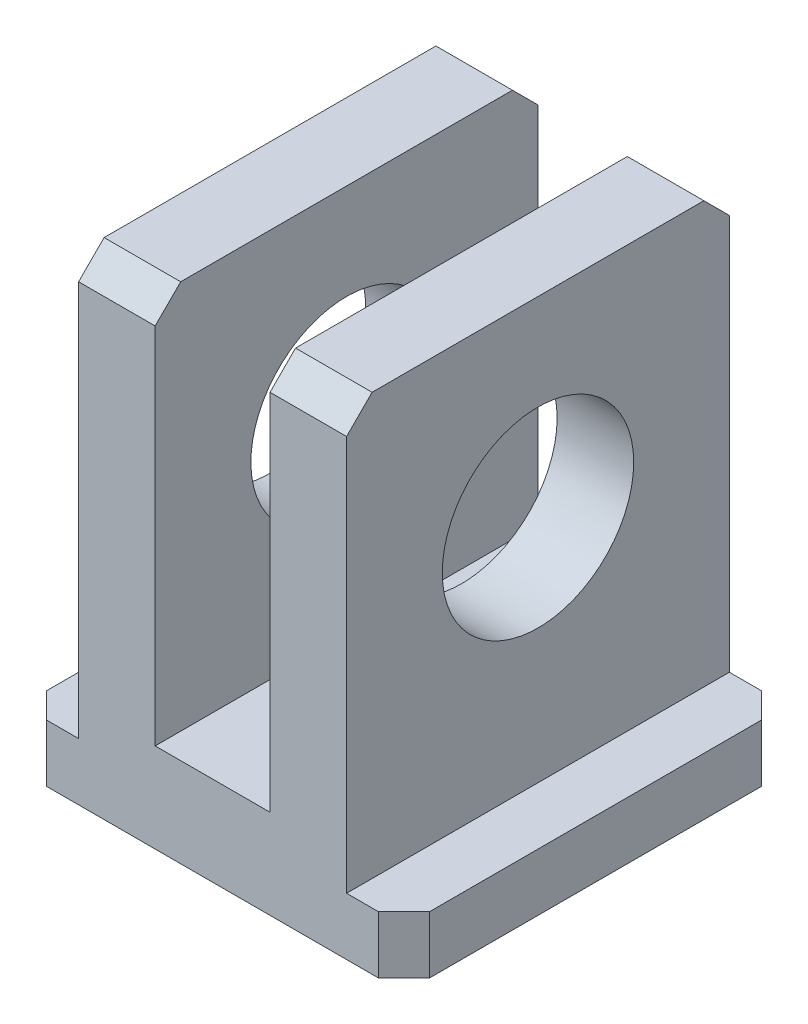
ISO-10303-21;
HEADER;
FILE_DESCRIPTION(('STEP AP214'),'2;1');
FILE_NAME('part.step','',(''),(''),'','','');
FILE_SCHEMA(('AUTOMOTIVE_DESIGN { 1 0 10303 214 1 1 1 1 }'));
ENDSEC;
DATA;
#1=APPLICATION_CONTEXT('core data for automotive mechanical design processes');
#2=APPLICATION_PROTOCOL_DEFINITION('international standard','automotive_design',2000,#1);
#3=PRODUCT_CONTEXT('',#1,'mechanical');
#4=PRODUCT('Part','Part','',(#3));
#5=PRODUCT_RELATED_PRODUCT_CATEGORY('part','',(#4));
#6=PRODUCT_DEFINITION_FORMATION('','',#4);
#7=PRODUCT_DEFINITION_CONTEXT('part definition',#1,'design');
#8=PRODUCT_DEFINITION('design','',#6,#7);
#9=PRODUCT_DEFINITION_SHAPE('','',#8);
#10=(LENGTH_UNIT() NAMED_UNIT(*) SI_UNIT(.MILLI.,.METRE.));
#11=(NAMED_UNIT(*) PLANE_ANGLE_UNIT() SI_UNIT($,.RADIAN.));
#12=(NAMED_UNIT(*) SI_UNIT($,.STERADIAN.) SOLID_ANGLE_UNIT());
#13=UNCERTAINTY_MEASURE_WITH_UNIT(LENGTH_MEASURE(1.E-05),#10,'distance_accuracy_value','');
#14=(GEOMETRIC_REPRESENTATION_CONTEXT(3) GLOBAL_UNCERTAINTY_ASSIGNED_CONTEXT((#13)) GLOBAL_UNIT_ASSIGNED_CONTEXT((#10,
#11,#12)) REPRESENTATION_CONTEXT('',''));
#15=CARTESIAN_POINT('',(0.,0.,0.));
#16=DIRECTION('',(0.,0.,1.));
#17=DIRECTION('',(1.,0.,0.));
#18=AXIS2_PLACEMENT_3D('',#15,#16,#17);
#19=CARTESIAN_POINT('',(-15.,35.5,15.));
#20=DIRECTION('',(0.,0.707106781186547,0.707106781186548));
#21=DIRECTION('',(0.,-0.707106781186548,0.707106781186547));
#22=AXIS2_PLACEMENT_3D('',#19,#20,#21);
#23=PLANE('',#22);
#24=DIRECTION('',(0.,0.707106781186548,-0.707106781186547));
#25=VECTOR('',#24,1.);
#26=CARTESIAN_POINT('',(-10.5,35.5,15.));
#27=LINE('',#26,#25);
#28=CARTESIAN_POINT('',(-10.5,35.5,15.));
#29=VERTEX_POINT('',#28);
#30=CARTESIAN_POINT('',(-10.5,37.5,13.));
#31=VERTEX_POINT('',#30);
#32=EDGE_CURVE('E257',#29,#31,#27,.T.);
#33=ORIENTED_EDGE('',*,*,#32,.F.);
#34=DIRECTION('',(1.,0.,0.));
#35=VECTOR('',#34,1.);
#36=CARTESIAN_POINT('',(-15.,35.5,15.));
#37=LINE('',#36,#35);
#38=CARTESIAN_POINT('',(-4.5,35.5,15.));
#39=VERTEX_POINT('',#38);
#40=EDGE_CURVE('E263',#29,#39,#37,.T.);
#41=ORIENTED_EDGE('',*,*,#40,.T.);
#42=DIRECTION('',(0.,-0.707106781186548,0.707106781186547));
#43=VECTOR('',#42,1.);
#44=CARTESIAN_POINT('',(-4.5,35.5,15.));
#45=LINE('',#44,#43);
#46=CARTESIAN_POINT('',(-4.5,37.5,13.));
#47=VERTEX_POINT('',#46);
#48=EDGE_CURVE('E253',#47,#39,#45,.T.);
#49=ORIENTED_EDGE('',*,*,#48,.F.);
#50=DIRECTION('',(1.,0.,0.));
#51=VECTOR('',#50,1.);
#52=CARTESIAN_POINT('',(-15.,37.5,13.));
#53=LINE('',#52,#51);
#54=EDGE_CURVE('E264',#31,#47,#53,.T.);
#55=ORIENTED_EDGE('',*,*,#54,.F.);
#56=EDGE_LOOP('',(#33,#41,#49,#55));
#57=FACE_BOUND('',#56,.T.);
#58=ADVANCED_FACE('F41',(#57),#23,.T.);
#59=CARTESIAN_POINT('',(-15.,37.5,13.));
#60=DIRECTION('',(0.,1.,0.));
#61=DIRECTION('',(0.,0.,1.));
#62=AXIS2_PLACEMENT_3D('',#59,#60,#61);
#63=PLANE('',#62);
#64=DIRECTION('',(0.,0.,1.));
#65=VECTOR('',#64,1.);
#66=CARTESIAN_POINT('',(-10.5,37.5,-15.));
#67=LINE('',#66,#65);
#68=CARTESIAN_POINT('',(-10.5,37.5,-13.));
#69=VERTEX_POINT('',#68);
#70=EDGE_CURVE('E64',#69,#31,#67,.T.);
#71=ORIENTED_EDGE('',*,*,#70,.T.);
#72=ORIENTED_EDGE('',*,*,#54,.T.);
#73=DIRECTION('',(0.,0.,1.));
#74=VECTOR('',#73,1.);
#75=CARTESIAN_POINT('',(-4.5,37.5,-15.));
#76=LINE('',#75,#74);
#77=CARTESIAN_POINT('',(-4.5,37.5,-13.));
#78=VERTEX_POINT('',#77);
#79=EDGE_CURVE('E236',#78,#47,#76,.T.);
#80=ORIENTED_EDGE('',*,*,#79,.F.);
#81=DIRECTION('',(1.,0.,0.));
#82=VECTOR('',#81,1.);
#83=CARTESIAN_POINT('',(-15.,37.5,-13.));
#84=LINE('',#83,#82);
#85=EDGE_CURVE('E268',#69,#78,#84,.T.);
#86=ORIENTED_EDGE('',*,*,#85,.F.);
#87=EDGE_LOOP('',(#71,#72,#80,#86));
#88=FACE_BOUND('',#87,.T.);
#89=ADVANCED_FACE('F391',(#88),#63,.T.);
#90=CARTESIAN_POINT('',(-15.,35.5,-15.));
#91=DIRECTION('',(0.,0.707106781186547,-0.707106781186548));
#92=DIRECTION('',(0.,0.707106781186548,0.707106781186547));
#93=AXIS2_PLACEMENT_3D('',#90,#91,#92);
#94=PLANE('',#93);
#95=DIRECTION('',(0.,-0.707106781186548,-0.707106781186547));
#96=VECTOR('',#95,1.);
#97=CARTESIAN_POINT('',(-10.5,35.5,-15.));
#98=LINE('',#97,#96);
#99=CARTESIAN_POINT('',(-10.5,35.5,-15.));
#100=VERTEX_POINT('',#99);
#101=EDGE_CURVE('E11',#69,#100,#98,.T.);
#102=ORIENTED_EDGE('',*,*,#101,.F.);
#103=ORIENTED_EDGE('',*,*,#85,.T.);
#104=DIRECTION('',(0.,0.707106781186548,0.707106781186547));
#105=VECTOR('',#104,1.);
#106=CARTESIAN_POINT('',(-4.5,35.5,-15.));
#107=LINE('',#106,#105);
#108=CARTESIAN_POINT('',(-4.5,35.5,-15.));
#109=VERTEX_POINT('',#108);
#110=EDGE_CURVE('E324',#109,#78,#107,.T.);
#111=ORIENTED_EDGE('',*,*,#110,.F.);
#112=DIRECTION('',(1.,0.,0.));
#113=VECTOR('',#112,1.);
#114=CARTESIAN_POINT('',(-15.,35.5,-15.));
#115=LINE('',#114,#113);
#116=EDGE_CURVE('E272',#100,#109,#115,.T.);
#117=ORIENTED_EDGE('',*,*,#116,.F.);
#118=EDGE_LOOP('',(#102,#103,#111,#117));
#119=FACE_BOUND('',#118,.T.);
#120=ADVANCED_FACE('F396',(#119),#94,.T.);
#121=CARTESIAN_POINT('',(-15.,4.5,13.));
#122=DIRECTION('',(1.,0.,0.));
#123=DIRECTION('',(0.,0.,-1.));
#124=AXIS2_PLACEMENT_3D('',#121,#122,#123);
#125=PLANE('',#124);
#126=DIRECTION('',(0.,-1.,0.));
#127=VECTOR('',#126,1.);
#128=CARTESIAN_POINT('',(-15.,4.5,13.));
#129=LINE('',#128,#127);
#130=CARTESIAN_POINT('',(-15.,4.5,13.));
#131=VERTEX_POINT('',#130);
#132=CARTESIAN_POINT('',(-15.,0.,13.));
#133=VERTEX_POINT('',#132);
#134=EDGE_CURVE('E319',#131,#133,#129,.T.);
#135=ORIENTED_EDGE('',*,*,#134,.F.);
#136=DIRECTION('',(0.,0.,1.));
#137=VECTOR('',#136,1.);
#138=CARTESIAN_POINT('',(-15.,4.5,-15.));
#139=LINE('',#138,#137);
#140=CARTESIAN_POINT('',(-15.,4.5,-13.));
#141=VERTEX_POINT('',#140);
#142=EDGE_CURVE('E186',#141,#131,#139,.T.);
#143=ORIENTED_EDGE('',*,*,#142,.F.);
#144=DIRECTION('',(0.,-1.,0.));
#145=VECTOR('',#144,1.);
#146=CARTESIAN_POINT('',(-15.,4.5,-13.));
#147=LINE('',#146,#145);
#148=CARTESIAN_POINT('',(-15.,0.,-13.));
#149=VERTEX_POINT('',#148);
#150=EDGE_CURVE('E284',#141,#149,#147,.T.);
#151=ORIENTED_EDGE('',*,*,#150,.T.);
#152=DIRECTION('',(0.,0.,1.));
#153=VECTOR('',#152,1.);
#154=CARTESIAN_POINT('',(-15.,0.,13.));
#155=LINE('',#154,#153);
#156=EDGE_CURVE('E285',#149,#133,#155,.T.);
#157=ORIENTED_EDGE('',*,*,#156,.T.);
#158=EDGE_LOOP('',(#135,#143,#151,#157));
#159=FACE_BOUND('',#158,.T.);
#160=ADVANCED_FACE('F43',(#159),#125,.F.);
#161=CARTESIAN_POINT('',(-15.,4.5,13.));
#162=DIRECTION('',(0.707106781186547,0.,-0.707106781186547));
#163=DIRECTION('',(-0.707106781186548,0.,-0.707106781186548));
#164=AXIS2_PLACEMENT_3D('',#161,#162,#163);
#165=PLANE('',#164);
#166=DIRECTION('',(0.707106781186548,0.,0.707106781186548));
#167=VECTOR('',#166,1.);
#168=CARTESIAN_POINT('',(-15.,0.,13.));
#169=LINE('',#168,#167);
#170=CARTESIAN_POINT('',(-13.,0.,15.));
#171=VERTEX_POINT('',#170);
#172=EDGE_CURVE('E288',#133,#171,#169,.T.);
#173=ORIENTED_EDGE('',*,*,#172,.T.);
#174=DIRECTION('',(0.,-1.,0.));
#175=VECTOR('',#174,1.);
#176=CARTESIAN_POINT('',(-13.,4.5,15.));
#177=LINE('',#176,#175);
#178=CARTESIAN_POINT('',(-13.,4.5,15.));
#179=VERTEX_POINT('',#178);
#180=EDGE_CURVE('E316',#179,#171,#177,.T.);
#181=ORIENTED_EDGE('',*,*,#180,.F.);
#182=DIRECTION('',(0.707106781186548,0.,0.707106781186548));
#183=VECTOR('',#182,1.);
#184=CARTESIAN_POINT('',(-15.,4.5,13.));
#185=LINE('',#184,#183);
#186=EDGE_CURVE('E275',#131,#179,#185,.T.);
#187=ORIENTED_EDGE('',*,*,#186,.F.);
#188=ORIENTED_EDGE('',*,*,#134,.T.);
#189=EDGE_LOOP('',(#173,#181,#187,#188));
#190=FACE_BOUND('',#189,.T.);
#191=ADVANCED_FACE('F379',(#190),#165,.F.);
#192=CARTESIAN_POINT('',(-13.,4.5,15.));
#193=DIRECTION('',(0.,0.,-1.));
#194=DIRECTION('',(-1.,0.,0.));
#195=AXIS2_PLACEMENT_3D('',#192,#193,#194);
#196=PLANE('',#195);
#197=ORIENTED_EDGE('',*,*,#40,.F.);
#198=DIRECTION('',(0.,1.,0.));
#199=VECTOR('',#198,1.);
#200=CARTESIAN_POINT('',(-10.5,4.5,15.));
#201=LINE('',#200,#199);
#202=CARTESIAN_POINT('',(-10.5,4.5,15.));
#203=VERTEX_POINT('',#202);
#204=EDGE_CURVE('E199',#203,#29,#201,.T.);
#205=ORIENTED_EDGE('',*,*,#204,.F.);
#206=DIRECTION('',(1.,0.,0.));
#207=VECTOR('',#206,1.);
#208=CARTESIAN_POINT('',(-15.,4.5,15.));
#209=LINE('',#208,#207);
#210=EDGE_CURVE('E184',#179,#203,#209,.T.);
#211=ORIENTED_EDGE('',*,*,#210,.F.);
#212=ORIENTED_EDGE('',*,*,#180,.T.);
#213=DIRECTION('',(1.,0.,0.));
#214=VECTOR('',#213,1.);
#215=CARTESIAN_POINT('',(-13.,0.,15.));
#216=LINE('',#215,#214);
#217=CARTESIAN_POINT('',(13.,0.,15.));
#218=VERTEX_POINT('',#217);
#219=EDGE_CURVE('E290',#171,#218,#216,.T.);
#220=ORIENTED_EDGE('',*,*,#219,.T.);
#221=DIRECTION('',(0.,-1.,0.));
#222=VECTOR('',#221,1.);
#223=CARTESIAN_POINT('',(13.,4.5,15.));
#224=LINE('',#223,#222);
#225=CARTESIAN_POINT('',(13.,4.5,15.));
#226=VERTEX_POINT('',#225);
#227=EDGE_CURVE('E313',#226,#218,#224,.T.);
#228=ORIENTED_EDGE('',*,*,#227,.F.);
#229=DIRECTION('',(1.,0.,0.));
#230=VECTOR('',#229,1.);
#231=CARTESIAN_POINT('',(15.,4.5,15.));
#232=LINE('',#231,#230);
#233=CARTESIAN_POINT('',(10.5,4.5,15.));
#234=VERTEX_POINT('',#233);
#235=EDGE_CURVE('E206',#234,#226,#232,.T.);
#236=ORIENTED_EDGE('',*,*,#235,.F.);
#237=DIRECTION('',(0.,-1.,0.));
#238=VECTOR('',#237,1.);
#239=CARTESIAN_POINT('',(10.5,4.5,15.));
#240=LINE('',#239,#238);
#241=CARTESIAN_POINT('',(10.5,35.5,15.));
#242=VERTEX_POINT('',#241);
#243=EDGE_CURVE('E221',#242,#234,#240,.T.);
#244=ORIENTED_EDGE('',*,*,#243,.F.);
#245=CARTESIAN_POINT('',(4.5,35.5,15.));
#246=VERTEX_POINT('',#245);
#247=EDGE_CURVE('E260',#246,#242,#37,.T.);
#248=ORIENTED_EDGE('',*,*,#247,.F.);
#249=DIRECTION('',(0.,1.,0.));
#250=VECTOR('',#249,1.);
#251=CARTESIAN_POINT('',(4.5,7.,15.));
#252=LINE('',#251,#250);
#253=CARTESIAN_POINT('',(4.5,7.,15.));
#254=VERTEX_POINT('',#253);
#255=EDGE_CURVE('E238',#254,#246,#252,.T.);
#256=ORIENTED_EDGE('',*,*,#255,.F.);
#257=DIRECTION('',(1.,0.,0.));
#258=VECTOR('',#257,1.);
#259=CARTESIAN_POINT('',(-4.5,7.,15.));
#260=LINE('',#259,#258);
#261=CARTESIAN_POINT('',(-4.5,7.,15.));
#262=VERTEX_POINT('',#261);
#263=EDGE_CURVE('E240',#262,#254,#260,.T.);
#264=ORIENTED_EDGE('',*,*,#263,.F.);
#265=DIRECTION('',(0.,-1.,0.));
#266=VECTOR('',#265,1.);
#267=CARTESIAN_POINT('',(-4.5,37.5,15.));
#268=LINE('',#267,#266);
#269=EDGE_CURVE('E220',#39,#262,#268,.T.);
#270=ORIENTED_EDGE('',*,*,#269,.F.);
#271=EDGE_LOOP('',(#197,#205,#211,#212,#220,#228,#236,#244,#248,#256,#264,#270));
#272=FACE_BOUND('',#271,.T.);
#273=ADVANCED_FACE('F352',(#272),#196,.F.);
#274=CARTESIAN_POINT('',(13.,4.5,15.));
#275=DIRECTION('',(-0.707106781186547,0.,-0.707106781186547));
#276=DIRECTION('',(-0.707106781186548,0.,0.707106781186548));
#277=AXIS2_PLACEMENT_3D('',#274,#275,#276);
#278=PLANE('',#277);
#279=DIRECTION('',(0.707106781186548,0.,-0.707106781186548));
#280=VECTOR('',#279,1.);
#281=CARTESIAN_POINT('',(13.,0.,15.));
#282=LINE('',#281,#280);
#283=CARTESIAN_POINT('',(15.,0.,13.));
#284=VERTEX_POINT('',#283);
#285=EDGE_CURVE('E292',#218,#284,#282,.T.);
#286=ORIENTED_EDGE('',*,*,#285,.T.);
#287=DIRECTION('',(0.,-1.,0.));
#288=VECTOR('',#287,1.);
#289=CARTESIAN_POINT('',(15.,4.5,13.));
#290=LINE('',#289,#288);
#291=CARTESIAN_POINT('',(15.,4.5,13.));
#292=VERTEX_POINT('',#291);
#293=EDGE_CURVE('E310',#292,#284,#290,.T.);
#294=ORIENTED_EDGE('',*,*,#293,.F.);
#295=DIRECTION('',(0.707106781186548,0.,-0.707106781186548));
#296=VECTOR('',#295,1.);
#297=CARTESIAN_POINT('',(13.,4.5,15.));
#298=LINE('',#297,#296);
#299=EDGE_CURVE('E277',#226,#292,#298,.T.);
#300=ORIENTED_EDGE('',*,*,#299,.F.);
#301=ORIENTED_EDGE('',*,*,#227,.T.);
#302=EDGE_LOOP('',(#286,#294,#300,#301));
#303=FACE_BOUND('',#302,.T.);
#304=ADVANCED_FACE('F437',(#303),#278,.F.);
#305=CARTESIAN_POINT('',(15.,4.5,13.));
#306=DIRECTION('',(-1.,0.,0.));
#307=DIRECTION('',(0.,0.,1.));
#308=AXIS2_PLACEMENT_3D('',#305,#306,#307);
#309=PLANE('',#308);
#310=DIRECTION('',(0.,-1.,0.));
#311=VECTOR('',#310,1.);
#312=CARTESIAN_POINT('',(15.,4.5,-13.));
#313=LINE('',#312,#311);
#314=CARTESIAN_POINT('',(15.,4.5,-13.));
#315=VERTEX_POINT('',#314);
#316=CARTESIAN_POINT('',(15.,0.,-13.));
#317=VERTEX_POINT('',#316);
#318=EDGE_CURVE('E307',#315,#317,#313,.T.);
#319=ORIENTED_EDGE('',*,*,#318,.F.);
#320=DIRECTION('',(0.,0.,1.));
#321=VECTOR('',#320,1.);
#322=CARTESIAN_POINT('',(15.,4.5,-15.));
#323=LINE('',#322,#321);
#324=EDGE_CURVE('E211',#315,#292,#323,.T.);
#325=ORIENTED_EDGE('',*,*,#324,.T.);
#326=ORIENTED_EDGE('',*,*,#293,.T.);
#327=DIRECTION('',(0.,0.,-1.));
#328=VECTOR('',#327,1.);
#329=CARTESIAN_POINT('',(15.,0.,13.));
#330=LINE('',#329,#328);
#331=EDGE_CURVE('E294',#284,#317,#330,.T.);
#332=ORIENTED_EDGE('',*,*,#331,.T.);
#333=EDGE_LOOP('',(#319,#325,#326,#332));
#334=FACE_BOUND('',#333,.T.);
#335=ADVANCED_FACE('F434',(#334),#309,.F.);
#336=CARTESIAN_POINT('',(13.,4.5,-15.));
#337=DIRECTION('',(-0.707106781186547,0.,0.707106781186547));
#338=DIRECTION('',(0.707106781186548,0.,0.707106781186548));
#339=AXIS2_PLACEMENT_3D('',#336,#337,#338);
#340=PLANE('',#339);
#341=DIRECTION('',(-0.707106781186548,0.,-0.707106781186548));
#342=VECTOR('',#341,1.);
#343=CARTESIAN_POINT('',(13.,0.,-15.));
#344=LINE('',#343,#342);
#345=CARTESIAN_POINT('',(13.,0.,-15.));
#346=VERTEX_POINT('',#345);
#347=EDGE_CURVE('E296',#317,#346,#344,.T.);
#348=ORIENTED_EDGE('',*,*,#347,.T.);
#349=DIRECTION('',(0.,-1.,0.));
#350=VECTOR('',#349,1.);
#351=CARTESIAN_POINT('',(13.,4.5,-15.));
#352=LINE('',#351,#350);
#353=CARTESIAN_POINT('',(13.,4.5,-15.));
#354=VERTEX_POINT('',#353);
#355=EDGE_CURVE('E304',#354,#346,#352,.T.);
#356=ORIENTED_EDGE('',*,*,#355,.F.);
#357=DIRECTION('',(-0.707106781186548,0.,-0.707106781186548));
#358=VECTOR('',#357,1.);
#359=CARTESIAN_POINT('',(13.,4.5,-15.));
#360=LINE('',#359,#358);
#361=EDGE_CURVE('E280',#315,#354,#360,.T.);
#362=ORIENTED_EDGE('',*,*,#361,.F.);
#363=ORIENTED_EDGE('',*,*,#318,.T.);
#364=EDGE_LOOP('',(#348,#356,#362,#363));
#365=FACE_BOUND('',#364,.T.);
#366=ADVANCED_FACE('F362',(#365),#340,.F.);
#367=CARTESIAN_POINT('',(-13.,4.5,-15.));
#368=DIRECTION('',(0.,0.,1.));
#369=DIRECTION('',(1.,0.,0.));
#370=AXIS2_PLACEMENT_3D('',#367,#368,#369);
#371=PLANE('',#370);
#372=DIRECTION('',(1.,0.,0.));
#373=VECTOR('',#372,1.);
#374=CARTESIAN_POINT('',(-15.,4.5,-15.));
#375=LINE('',#374,#373);
#376=CARTESIAN_POINT('',(-13.,4.5,-15.));
#377=VERTEX_POINT('',#376);
#378=CARTESIAN_POINT('',(-10.5,4.5,-15.));
#379=VERTEX_POINT('',#378);
#380=EDGE_CURVE('E181',#377,#379,#375,.T.);
#381=ORIENTED_EDGE('',*,*,#380,.T.);
#382=DIRECTION('',(0.,1.,0.));
#383=VECTOR('',#382,1.);
#384=CARTESIAN_POINT('',(-10.5,4.5,-15.));
#385=LINE('',#384,#383);
#386=EDGE_CURVE('E189',#379,#100,#385,.T.);
#387=ORIENTED_EDGE('',*,*,#386,.T.);
#388=ORIENTED_EDGE('',*,*,#116,.T.);
#389=DIRECTION('',(0.,-1.,0.));
#390=VECTOR('',#389,1.);
#391=CARTESIAN_POINT('',(-4.5,37.5,-15.));
#392=LINE('',#391,#390);
#393=CARTESIAN_POINT('',(-4.5,7.,-15.));
#394=VERTEX_POINT('',#393);
#395=EDGE_CURVE('E241',#109,#394,#392,.T.);
#396=ORIENTED_EDGE('',*,*,#395,.T.);
#397=DIRECTION('',(1.,0.,0.));
#398=VECTOR('',#397,1.);
#399=CARTESIAN_POINT('',(-4.5,7.,-15.));
#400=LINE('',#399,#398);
#401=CARTESIAN_POINT('',(4.5,7.,-15.));
#402=VERTEX_POINT('',#401);
#403=EDGE_CURVE('E247',#394,#402,#400,.T.);
#404=ORIENTED_EDGE('',*,*,#403,.T.);
#405=DIRECTION('',(0.,1.,0.));
#406=VECTOR('',#405,1.);
#407=CARTESIAN_POINT('',(4.5,7.,-15.));
#408=LINE('',#407,#406);
#409=CARTESIAN_POINT('',(4.5,35.5,-15.));
#410=VERTEX_POINT('',#409);
#411=EDGE_CURVE('E232',#402,#410,#408,.T.);
#412=ORIENTED_EDGE('',*,*,#411,.T.);
#413=CARTESIAN_POINT('',(10.5,35.5,-15.));
#414=VERTEX_POINT('',#413);
#415=EDGE_CURVE('E259',#410,#414,#115,.T.);
#416=ORIENTED_EDGE('',*,*,#415,.T.);
#417=DIRECTION('',(0.,-1.,0.));
#418=VECTOR('',#417,1.);
#419=CARTESIAN_POINT('',(10.5,4.5,-15.));
#420=LINE('',#419,#418);
#421=CARTESIAN_POINT('',(10.5,4.5,-15.));
#422=VERTEX_POINT('',#421);
#423=EDGE_CURVE('E214',#414,#422,#420,.T.);
#424=ORIENTED_EDGE('',*,*,#423,.T.);
#425=DIRECTION('',(1.,0.,0.));
#426=VECTOR('',#425,1.);
#427=CARTESIAN_POINT('',(15.,4.5,-15.));
#428=LINE('',#427,#426);
#429=EDGE_CURVE('E223',#422,#354,#428,.T.);
#430=ORIENTED_EDGE('',*,*,#429,.T.);
#431=ORIENTED_EDGE('',*,*,#355,.T.);
#432=DIRECTION('',(-1.,0.,0.));
#433=VECTOR('',#432,1.);
#434=CARTESIAN_POINT('',(-13.,0.,-15.));
#435=LINE('',#434,#433);
#436=CARTESIAN_POINT('',(-13.,0.,-15.));
#437=VERTEX_POINT('',#436);
#438=EDGE_CURVE('E298',#346,#437,#435,.T.);
#439=ORIENTED_EDGE('',*,*,#438,.T.);
#440=DIRECTION('',(0.,-1.,0.));
#441=VECTOR('',#440,1.);
#442=CARTESIAN_POINT('',(-13.,4.5,-15.));
#443=LINE('',#442,#441);
#444=EDGE_CURVE('E197',#377,#437,#443,.T.);
#445=ORIENTED_EDGE('',*,*,#444,.F.);
#446=EDGE_LOOP('',(#381,#387,#388,#396,#404,#412,#416,#424,#430,#431,#439,#445));
#447=FACE_BOUND('',#446,.T.);
#448=ADVANCED_FACE('F195',(#447),#371,.F.);
#449=CARTESIAN_POINT('',(-15.,4.5,-13.));
#450=DIRECTION('',(0.707106781186547,0.,0.707106781186547));
#451=DIRECTION('',(0.707106781186548,0.,-0.707106781186548));
#452=AXIS2_PLACEMENT_3D('',#449,#450,#451);
#453=PLANE('',#452);
#454=DIRECTION('',(-0.707106781186548,0.,0.707106781186548));
#455=VECTOR('',#454,1.);
#456=CARTESIAN_POINT('',(-15.,0.,-13.));
#457=LINE('',#456,#455);
#458=EDGE_CURVE('E278',#437,#149,#457,.T.);
#459=ORIENTED_EDGE('',*,*,#458,.T.);
#460=ORIENTED_EDGE('',*,*,#150,.F.);
#461=DIRECTION('',(-0.707106781186548,0.,0.707106781186548));
#462=VECTOR('',#461,1.);
#463=CARTESIAN_POINT('',(-15.,4.5,-13.));
#464=LINE('',#463,#462);
#465=EDGE_CURVE('E282',#377,#141,#464,.T.);
#466=ORIENTED_EDGE('',*,*,#465,.F.);
#467=ORIENTED_EDGE('',*,*,#444,.T.);
#468=EDGE_LOOP('',(#459,#460,#466,#467));
#469=FACE_BOUND('',#468,.T.);
#470=ADVANCED_FACE('F372',(#469),#453,.F.);
#471=CARTESIAN_POINT('',(0.,0.,0.));
#472=DIRECTION('',(0.,-1.,0.));
#473=DIRECTION('',(0.,0.,-1.));
#474=AXIS2_PLACEMENT_3D('',#471,#472,#473);
#475=PLANE('',#474);
#476=ORIENTED_EDGE('',*,*,#156,.F.);
#477=ORIENTED_EDGE('',*,*,#458,.F.);
#478=ORIENTED_EDGE('',*,*,#438,.F.);
#479=ORIENTED_EDGE('',*,*,#347,.F.);
#480=ORIENTED_EDGE('',*,*,#331,.F.);
#481=ORIENTED_EDGE('',*,*,#285,.F.);
#482=ORIENTED_EDGE('',*,*,#219,.F.);
#483=ORIENTED_EDGE('',*,*,#172,.F.);
#484=EDGE_LOOP('',(#476,#477,#478,#479,#480,#481,#482,#483));
#485=FACE_BOUND('',#484,.T.);
#486=ADVANCED_FACE('F368',(#485),#475,.T.);
#487=DIRECTION('',(0.,-0.707106781186548,0.707106781186547));
#488=VECTOR('',#487,1.);
#489=CARTESIAN_POINT('',(10.5,35.5,15.));
#490=LINE('',#489,#488);
#491=CARTESIAN_POINT('',(10.5,37.5,13.));
#492=VERTEX_POINT('',#491);
#493=EDGE_CURVE('E255',#492,#242,#490,.T.);
#494=ORIENTED_EDGE('',*,*,#493,.F.);
#495=CARTESIAN_POINT('',(4.5,37.5,13.));
#496=VERTEX_POINT('',#495);
#497=EDGE_CURVE('E265',#496,#492,#53,.T.);
#498=ORIENTED_EDGE('',*,*,#497,.F.);
#499=DIRECTION('',(0.,0.707106781186548,-0.707106781186547));
#500=VECTOR('',#499,1.);
#501=CARTESIAN_POINT('',(4.5,35.5,15.));
#502=LINE('',#501,#500);
#503=EDGE_CURVE('E208',#246,#496,#502,.T.);
#504=ORIENTED_EDGE('',*,*,#503,.F.);
#505=ORIENTED_EDGE('',*,*,#247,.T.);
#506=EDGE_LOOP('',(#494,#498,#504,#505));
#507=FACE_BOUND('',#506,.T.);
#508=ADVANCED_FACE('F349',(#507),#23,.T.);
#509=DIRECTION('',(0.,0.,1.));
#510=VECTOR('',#509,1.);
#511=CARTESIAN_POINT('',(10.5,37.5,-15.));
#512=LINE('',#511,#510);
#513=CARTESIAN_POINT('',(10.5,37.5,-13.));
#514=VERTEX_POINT('',#513);
#515=EDGE_CURVE('E215',#514,#492,#512,.T.);
#516=ORIENTED_EDGE('',*,*,#515,.F.);
#517=CARTESIAN_POINT('',(4.5,37.5,-13.));
#518=VERTEX_POINT('',#517);
#519=EDGE_CURVE('E269',#518,#514,#84,.T.);
#520=ORIENTED_EDGE('',*,*,#519,.F.);
#521=DIRECTION('',(0.,0.,1.));
#522=VECTOR('',#521,1.);
#523=CARTESIAN_POINT('',(4.5,37.5,-15.));
#524=LINE('',#523,#522);
#525=EDGE_CURVE('E57',#518,#496,#524,.T.);
#526=ORIENTED_EDGE('',*,*,#525,.T.);
#527=ORIENTED_EDGE('',*,*,#497,.T.);
#528=EDGE_LOOP('',(#516,#520,#526,#527));
#529=FACE_BOUND('',#528,.T.);
#530=ADVANCED_FACE('F335',(#529),#63,.T.);
#531=DIRECTION('',(0.,0.707106781186548,0.707106781186547));
#532=VECTOR('',#531,1.);
#533=CARTESIAN_POINT('',(10.5,35.5,-15.));
#534=LINE('',#533,#532);
#535=EDGE_CURVE('E50',#414,#514,#534,.T.);
#536=ORIENTED_EDGE('',*,*,#535,.F.);
#537=ORIENTED_EDGE('',*,*,#415,.F.);
#538=DIRECTION('',(0.,-0.707106781186548,-0.707106781186547));
#539=VECTOR('',#538,1.);
#540=CARTESIAN_POINT('',(4.5,35.5,-15.));
#541=LINE('',#540,#539);
#542=EDGE_CURVE('E322',#518,#410,#541,.T.);
#543=ORIENTED_EDGE('',*,*,#542,.F.);
#544=ORIENTED_EDGE('',*,*,#519,.T.);
#545=EDGE_LOOP('',(#536,#537,#543,#544));
#546=FACE_BOUND('',#545,.T.);
#547=ADVANCED_FACE('F337',(#546),#94,.T.);
#548=CARTESIAN_POINT('',(-4.5,37.5,-15.));
#549=DIRECTION('',(-1.,0.,0.));
#550=DIRECTION('',(0.,-1.,0.));
#551=AXIS2_PLACEMENT_3D('',#548,#549,#550);
#552=PLANE('',#551);
#553=CARTESIAN_POINT('',(-4.5,22.5,0.));
#554=DIRECTION('',(-1.,0.,0.));
#555=DIRECTION('',(0.,-1.,0.));
#556=AXIS2_PLACEMENT_3D('',#553,#554,#555);
#557=CIRCLE('',#556,7.5);
#558=CARTESIAN_POINT('',(-4.5,15.,0.));
#559=VERTEX_POINT('',#558);
#560=EDGE_CURVE('E203',#559,#559,#557,.T.);
#561=ORIENTED_EDGE('',*,*,#560,.T.);
#562=EDGE_LOOP('',(#561));
#563=FACE_BOUND('',#562,.T.);
#564=ORIENTED_EDGE('',*,*,#48,.T.);
#565=ORIENTED_EDGE('',*,*,#269,.T.);
#566=DIRECTION('',(0.,0.,1.));
#567=VECTOR('',#566,1.);
#568=CARTESIAN_POINT('',(-4.5,7.,-15.));
#569=LINE('',#568,#567);
#570=EDGE_CURVE('E229',#394,#262,#569,.T.);
#571=ORIENTED_EDGE('',*,*,#570,.F.);
#572=ORIENTED_EDGE('',*,*,#395,.F.);
#573=ORIENTED_EDGE('',*,*,#110,.T.);
#574=ORIENTED_EDGE('',*,*,#79,.T.);
#575=EDGE_LOOP('',(#564,#565,#571,#572,#573,#574));
#576=FACE_BOUND('',#575,.T.);
#577=ADVANCED_FACE('F398',(#563,#576),#552,.F.);
#578=CARTESIAN_POINT('',(4.5,7.,-15.));
#579=DIRECTION('',(1.,0.,0.));
#580=DIRECTION('',(0.,1.,0.));
#581=AXIS2_PLACEMENT_3D('',#578,#579,#580);
#582=PLANE('',#581);
#583=CARTESIAN_POINT('',(4.5,22.5,0.));
#584=DIRECTION('',(1.,0.,0.));
#585=DIRECTION('',(0.,1.,0.));
#586=AXIS2_PLACEMENT_3D('',#583,#584,#585);
#587=CIRCLE('',#586,7.5);
#588=CARTESIAN_POINT('',(4.5,30.,0.));
#589=VERTEX_POINT('',#588);
#590=EDGE_CURVE('E536',#589,#589,#587,.T.);
#591=ORIENTED_EDGE('',*,*,#590,.T.);
#592=EDGE_LOOP('',(#591));
#593=FACE_BOUND('',#592,.T.);
#594=ORIENTED_EDGE('',*,*,#503,.T.);
#595=ORIENTED_EDGE('',*,*,#525,.F.);
#596=ORIENTED_EDGE('',*,*,#542,.T.);
#597=ORIENTED_EDGE('',*,*,#411,.F.);
#598=DIRECTION('',(0.,0.,1.));
#599=VECTOR('',#598,1.);
#600=CARTESIAN_POINT('',(4.5,7.,-15.));
#601=LINE('',#600,#599);
#602=EDGE_CURVE('E233',#402,#254,#601,.T.);
#603=ORIENTED_EDGE('',*,*,#602,.T.);
#604=ORIENTED_EDGE('',*,*,#255,.T.);
#605=EDGE_LOOP('',(#594,#595,#596,#597,#603,#604));
#606=FACE_BOUND('',#605,.T.);
#607=ADVANCED_FACE('F339',(#593,#606),#582,.F.);
#608=CARTESIAN_POINT('',(-4.5,7.,-15.));
#609=DIRECTION('',(0.,-1.,0.));
#610=DIRECTION('',(0.,0.,-1.));
#611=AXIS2_PLACEMENT_3D('',#608,#609,#610);
#612=PLANE('',#611);
#613=ORIENTED_EDGE('',*,*,#263,.T.);
#614=ORIENTED_EDGE('',*,*,#602,.F.);
#615=ORIENTED_EDGE('',*,*,#403,.F.);
#616=ORIENTED_EDGE('',*,*,#570,.T.);
#617=EDGE_LOOP('',(#613,#614,#615,#616));
#618=FACE_BOUND('',#617,.T.);
#619=ADVANCED_FACE('F342',(#618),#612,.F.);
#620=CARTESIAN_POINT('',(15.,4.5,-15.));
#621=DIRECTION('',(0.,-1.,0.));
#622=DIRECTION('',(0.,0.,-1.));
#623=AXIS2_PLACEMENT_3D('',#620,#621,#622);
#624=PLANE('',#623);
#625=ORIENTED_EDGE('',*,*,#324,.F.);
#626=ORIENTED_EDGE('',*,*,#361,.T.);
#627=ORIENTED_EDGE('',*,*,#429,.F.);
#628=DIRECTION('',(0.,0.,1.));
#629=VECTOR('',#628,1.);
#630=CARTESIAN_POINT('',(10.5,4.5,-15.));
#631=LINE('',#630,#629);
#632=EDGE_CURVE('E217',#422,#234,#631,.T.);
#633=ORIENTED_EDGE('',*,*,#632,.T.);
#634=ORIENTED_EDGE('',*,*,#235,.T.);
#635=ORIENTED_EDGE('',*,*,#299,.T.);
#636=EDGE_LOOP('',(#625,#626,#627,#633,#634,#635));
#637=FACE_BOUND('',#636,.T.);
#638=ADVANCED_FACE('F357',(#637),#624,.F.);
#639=CARTESIAN_POINT('',(10.5,4.5,-15.));
#640=DIRECTION('',(-1.,0.,0.));
#641=DIRECTION('',(0.,0.,1.));
#642=AXIS2_PLACEMENT_3D('',#639,#640,#641);
#643=PLANE('',#642);
#644=CARTESIAN_POINT('',(10.5,22.5,0.));
#645=DIRECTION('',(1.,0.,0.));
#646=DIRECTION('',(0.,0.,-1.));
#647=AXIS2_PLACEMENT_3D('',#644,#645,#646);
#648=CIRCLE('',#647,7.5);
#649=CARTESIAN_POINT('',(10.5,22.5,-7.5));
#650=VERTEX_POINT('',#649);
#651=EDGE_CURVE('E533',#650,#650,#648,.T.);
#652=ORIENTED_EDGE('',*,*,#651,.F.);
#653=EDGE_LOOP('',(#652));
#654=FACE_BOUND('',#653,.T.);
#655=ORIENTED_EDGE('',*,*,#493,.T.);
#656=ORIENTED_EDGE('',*,*,#243,.T.);
#657=ORIENTED_EDGE('',*,*,#632,.F.);
#658=ORIENTED_EDGE('',*,*,#423,.F.);
#659=ORIENTED_EDGE('',*,*,#535,.T.);
#660=ORIENTED_EDGE('',*,*,#515,.T.);
#661=EDGE_LOOP('',(#655,#656,#657,#658,#659,#660));
#662=FACE_BOUND('',#661,.T.);
#663=ADVANCED_FACE('F329',(#654,#662),#643,.F.);
#664=CARTESIAN_POINT('',(-15.,4.5,-15.));
#665=DIRECTION('',(0.,-1.,0.));
#666=DIRECTION('',(0.,0.,-1.));
#667=AXIS2_PLACEMENT_3D('',#664,#665,#666);
#668=PLANE('',#667);
#669=ORIENTED_EDGE('',*,*,#210,.T.);
#670=DIRECTION('',(0.,0.,1.));
#671=VECTOR('',#670,1.);
#672=CARTESIAN_POINT('',(-10.5,4.5,-15.));
#673=LINE('',#672,#671);
#674=EDGE_CURVE('E177',#379,#203,#673,.T.);
#675=ORIENTED_EDGE('',*,*,#674,.F.);
#676=ORIENTED_EDGE('',*,*,#380,.F.);
#677=ORIENTED_EDGE('',*,*,#465,.T.);
#678=ORIENTED_EDGE('',*,*,#142,.T.);
#679=ORIENTED_EDGE('',*,*,#186,.T.);
#680=EDGE_LOOP('',(#669,#675,#676,#677,#678,#679));
#681=FACE_BOUND('',#680,.T.);
#682=ADVANCED_FACE('F179',(#681),#668,.F.);
#683=CARTESIAN_POINT('',(-10.5,4.5,-15.));
#684=DIRECTION('',(1.,0.,0.));
#685=DIRECTION('',(0.,0.,-1.));
#686=AXIS2_PLACEMENT_3D('',#683,#684,#685);
#687=PLANE('',#686);
#688=CARTESIAN_POINT('',(-10.5,22.5,0.));
#689=DIRECTION('',(1.,0.,0.));
#690=DIRECTION('',(0.,0.,-1.));
#691=AXIS2_PLACEMENT_3D('',#688,#689,#690);
#692=CIRCLE('',#691,7.5);
#693=CARTESIAN_POINT('',(-10.5,22.5,-7.5));
#694=VERTEX_POINT('',#693);
#695=EDGE_CURVE('E45',#694,#694,#692,.T.);
#696=ORIENTED_EDGE('',*,*,#695,.T.);
#697=EDGE_LOOP('',(#696));
#698=FACE_BOUND('',#697,.T.);
#699=ORIENTED_EDGE('',*,*,#32,.T.);
#700=ORIENTED_EDGE('',*,*,#70,.F.);
#701=ORIENTED_EDGE('',*,*,#101,.T.);
#702=ORIENTED_EDGE('',*,*,#386,.F.);
#703=ORIENTED_EDGE('',*,*,#674,.T.);
#704=ORIENTED_EDGE('',*,*,#204,.T.);
#705=EDGE_LOOP('',(#699,#700,#701,#702,#703,#704));
#706=FACE_BOUND('',#705,.T.);
#707=ADVANCED_FACE('F190',(#698,#706),#687,.F.);
#708=CARTESIAN_POINT('',(-19.5,22.5,0.));
#709=DIRECTION('',(1.,0.,0.));
#710=DIRECTION('',(0.,0.,-1.));
#711=AXIS2_PLACEMENT_3D('',#708,#709,#710);
#712=CYLINDRICAL_SURFACE('',#711,7.5);
#713=ORIENTED_EDGE('',*,*,#695,.F.);
#714=EDGE_LOOP('',(#713));
#715=FACE_BOUND('',#714,.T.);
#716=ORIENTED_EDGE('',*,*,#560,.F.);
#717=EDGE_LOOP('',(#716));
#718=FACE_BOUND('',#717,.T.);
#719=ADVANCED_FACE('F505',(#715,#718),#712,.F.);
#720=ORIENTED_EDGE('',*,*,#651,.T.);
#721=EDGE_LOOP('',(#720));
#722=FACE_BOUND('',#721,.T.);
#723=ORIENTED_EDGE('',*,*,#590,.F.);
#724=EDGE_LOOP('',(#723));
#725=FACE_BOUND('',#724,.T.);
#726=ADVANCED_FACE('F514',(#722,#725),#712,.F.);
#727=CLOSED_SHELL('',(#58,#89,#120,#160,#191,#273,#304,#335,#366,#448,#470,#486,#508,#530,#547,
#577,#607,#619,#638,#663,#682,#707,#719,#726));
#728=MANIFOLD_SOLID_BREP('B2',#727);
#729=ADVANCED_BREP_SHAPE_REPRESENTATION('',(#18,#728),#14);
#730=SHAPE_DEFINITION_REPRESENTATION(#9,#729);
ENDSEC;
END-ISO-10303-21;
